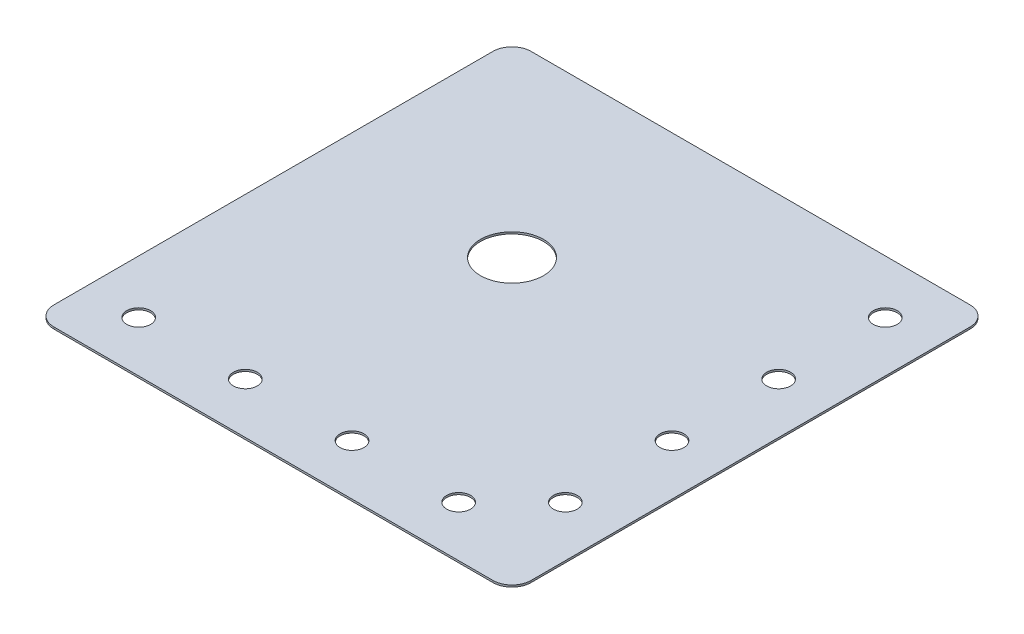
ISO-10303-21;
HEADER;
FILE_DESCRIPTION(('STEP AP214'),'2;1');
FILE_NAME('part.step','',(''),(''),'','','');
FILE_SCHEMA(('AUTOMOTIVE_DESIGN { 1 0 10303 214 1 1 1 1 }'));
ENDSEC;
DATA;
#1=APPLICATION_CONTEXT('core data for automotive mechanical design processes');
#2=APPLICATION_PROTOCOL_DEFINITION('international standard','automotive_design',2000,#1);
#3=PRODUCT_CONTEXT('',#1,'mechanical');
#4=PRODUCT('Part','Part','',(#3));
#5=PRODUCT_RELATED_PRODUCT_CATEGORY('part','',(#4));
#6=PRODUCT_DEFINITION_FORMATION('','',#4);
#7=PRODUCT_DEFINITION_CONTEXT('part definition',#1,'design');
#8=PRODUCT_DEFINITION('design','',#6,#7);
#9=PRODUCT_DEFINITION_SHAPE('','',#8);
#10=(LENGTH_UNIT() NAMED_UNIT(*) SI_UNIT(.MILLI.,.METRE.));
#11=(NAMED_UNIT(*) PLANE_ANGLE_UNIT() SI_UNIT($,.RADIAN.));
#12=(NAMED_UNIT(*) SI_UNIT($,.STERADIAN.) SOLID_ANGLE_UNIT());
#13=UNCERTAINTY_MEASURE_WITH_UNIT(LENGTH_MEASURE(1.E-05),#10,'distance_accuracy_value','');
#14=(GEOMETRIC_REPRESENTATION_CONTEXT(3) GLOBAL_UNCERTAINTY_ASSIGNED_CONTEXT((#13)) GLOBAL_UNIT_ASSIGNED_CONTEXT((#10,
#11,#12)) REPRESENTATION_CONTEXT('',''));
#15=CARTESIAN_POINT('',(0.,0.,0.));
#16=DIRECTION('',(0.,0.,1.));
#17=DIRECTION('',(1.,0.,0.));
#18=AXIS2_PLACEMENT_3D('',#15,#16,#17);
#19=CARTESIAN_POINT('',(-35.3672430253527,0.2,-42.9250026519572));
#20=DIRECTION('',(0.,1.,0.));
#21=DIRECTION('',(0.,0.,1.));
#22=AXIS2_PLACEMENT_3D('',#19,#20,#21);
#23=PLANE('',#22);
#24=CARTESIAN_POINT('',(-20.6047430253527,0.2,-0.225002651957146));
#25=DIRECTION('',(0.,1.,0.));
#26=DIRECTION('',(0.,0.,1.));
#27=AXIS2_PLACEMENT_3D('',#24,#25,#26);
#28=CIRCLE('',#27,1.25);
#29=CARTESIAN_POINT('',(-20.6047430253527,0.2,1.02499734804285));
#30=VERTEX_POINT('',#29);
#31=EDGE_CURVE('E224',#30,#30,#28,.T.);
#32=ORIENTED_EDGE('',*,*,#31,.F.);
#33=EDGE_LOOP('',(#32));
#34=FACE_BOUND('',#33,.T.);
#35=CARTESIAN_POINT('',(1.74525697464729,0.2,-0.225002651957146));
#36=DIRECTION('',(0.,1.,0.));
#37=DIRECTION('',(0.,0.,1.));
#38=AXIS2_PLACEMENT_3D('',#35,#36,#37);
#39=CIRCLE('',#38,1.25);
#40=CARTESIAN_POINT('',(1.74525697464729,0.2,1.02499734804285));
#41=VERTEX_POINT('',#40);
#42=EDGE_CURVE('E212',#41,#41,#39,.T.);
#43=ORIENTED_EDGE('',*,*,#42,.F.);
#44=EDGE_LOOP('',(#43));
#45=FACE_BOUND('',#44,.T.);
#46=CARTESIAN_POINT('',(7.3327569746473,0.2,-39.3375026519572));
#47=DIRECTION('',(0.,1.,0.));
#48=DIRECTION('',(0.,0.,1.));
#49=AXIS2_PLACEMENT_3D('',#46,#47,#48);
#50=CIRCLE('',#49,1.25);
#51=CARTESIAN_POINT('',(7.3327569746473,0.2,-38.0875026519572));
#52=VERTEX_POINT('',#51);
#53=EDGE_CURVE('E200',#52,#52,#50,.T.);
#54=ORIENTED_EDGE('',*,*,#53,.F.);
#55=EDGE_LOOP('',(#54));
#56=FACE_BOUND('',#55,.T.);
#57=CARTESIAN_POINT('',(7.3327569746473,0.2,-16.9875026519572));
#58=DIRECTION('',(0.,1.,0.));
#59=DIRECTION('',(0.,0.,1.));
#60=AXIS2_PLACEMENT_3D('',#57,#58,#59);
#61=CIRCLE('',#60,1.25);
#62=CARTESIAN_POINT('',(7.3327569746473,0.2,-15.7375026519572));
#63=VERTEX_POINT('',#62);
#64=EDGE_CURVE('E188',#63,#63,#61,.T.);
#65=ORIENTED_EDGE('',*,*,#64,.F.);
#66=EDGE_LOOP('',(#65));
#67=FACE_BOUND('',#66,.T.);
#68=CARTESIAN_POINT('',(-35.3672430253527,0.2,-42.9250026519572));
#69=DIRECTION('',(0.,1.,0.));
#70=DIRECTION('',(0.,0.,1.));
#71=AXIS2_PLACEMENT_3D('',#68,#69,#70);
#72=CIRCLE('',#71,2.);
#73=CARTESIAN_POINT('',(-35.3672430253527,0.2,-44.9250026519572));
#74=VERTEX_POINT('',#73);
#75=CARTESIAN_POINT('',(-37.3672430253527,0.2,-42.9250026519572));
#76=VERTEX_POINT('',#75);
#77=EDGE_CURVE('E151',#74,#76,#72,.T.);
#78=ORIENTED_EDGE('',*,*,#77,.T.);
#79=DIRECTION('',(0.,0.,1.));
#80=VECTOR('',#79,1.);
#81=CARTESIAN_POINT('',(-37.3672430253527,0.2,-42.9250026519572));
#82=LINE('',#81,#80);
#83=CARTESIAN_POINT('',(-37.3672430253527,0.2,3.07499734804285));
#84=VERTEX_POINT('',#83);
#85=EDGE_CURVE('E99',#76,#84,#82,.T.);
#86=ORIENTED_EDGE('',*,*,#85,.T.);
#87=CARTESIAN_POINT('',(-35.3672430253527,0.2,3.07499734804285));
#88=DIRECTION('',(0.,1.,0.));
#89=DIRECTION('',(0.,0.,1.));
#90=AXIS2_PLACEMENT_3D('',#87,#88,#89);
#91=CIRCLE('',#90,2.);
#92=CARTESIAN_POINT('',(-35.3672430253527,0.2,5.07499734804285));
#93=VERTEX_POINT('',#92);
#94=EDGE_CURVE('E166',#84,#93,#91,.T.);
#95=ORIENTED_EDGE('',*,*,#94,.T.);
#96=DIRECTION('',(1.,0.,0.));
#97=VECTOR('',#96,1.);
#98=CARTESIAN_POINT('',(-35.3672430253527,0.2,5.07499734804285));
#99=LINE('',#98,#97);
#100=CARTESIAN_POINT('',(10.6327569746473,0.2,5.07499734804285));
#101=VERTEX_POINT('',#100);
#102=EDGE_CURVE('E179',#93,#101,#99,.T.);
#103=ORIENTED_EDGE('',*,*,#102,.T.);
#104=CARTESIAN_POINT('',(10.6327569746473,0.2,3.07499734804285));
#105=DIRECTION('',(0.,1.,0.));
#106=DIRECTION('',(0.,0.,1.));
#107=AXIS2_PLACEMENT_3D('',#104,#105,#106);
#108=CIRCLE('',#107,2.);
#109=CARTESIAN_POINT('',(12.6327569746473,0.2,3.07499734804285));
#110=VERTEX_POINT('',#109);
#111=EDGE_CURVE('E118',#101,#110,#108,.T.);
#112=ORIENTED_EDGE('',*,*,#111,.T.);
#113=DIRECTION('',(0.,0.,-1.));
#114=VECTOR('',#113,1.);
#115=CARTESIAN_POINT('',(12.6327569746473,0.2,3.07499734804285));
#116=LINE('',#115,#114);
#117=CARTESIAN_POINT('',(12.6327569746473,0.2,-42.9250026519572));
#118=VERTEX_POINT('',#117);
#119=EDGE_CURVE('E112',#110,#118,#116,.T.);
#120=ORIENTED_EDGE('',*,*,#119,.T.);
#121=CARTESIAN_POINT('',(10.6327569746473,0.2,-42.9250026519572));
#122=DIRECTION('',(0.,1.,0.));
#123=DIRECTION('',(0.,0.,1.));
#124=AXIS2_PLACEMENT_3D('',#121,#122,#123);
#125=CIRCLE('',#124,2.);
#126=CARTESIAN_POINT('',(10.6327569746473,0.2,-44.9250026519572));
#127=VERTEX_POINT('',#126);
#128=EDGE_CURVE('E116',#118,#127,#125,.T.);
#129=ORIENTED_EDGE('',*,*,#128,.T.);
#130=DIRECTION('',(-1.,0.,0.));
#131=VECTOR('',#130,1.);
#132=CARTESIAN_POINT('',(10.6327569746473,0.2,-44.9250026519572));
#133=LINE('',#132,#131);
#134=EDGE_CURVE('E56',#127,#74,#133,.T.);
#135=ORIENTED_EDGE('',*,*,#134,.T.);
#136=EDGE_LOOP('',(#78,#86,#95,#103,#112,#120,#129,#135));
#137=FACE_BOUND('',#136,.T.);
#138=CARTESIAN_POINT('',(-17.6672430253527,0.2,-25.2250026519572));
#139=DIRECTION('',(0.,1.,0.));
#140=DIRECTION('',(0.,0.,1.));
#141=AXIS2_PLACEMENT_3D('',#138,#139,#140);
#142=CIRCLE('',#141,3.3);
#143=CARTESIAN_POINT('',(-17.6672430253527,0.2,-21.9250026519572));
#144=VERTEX_POINT('',#143);
#145=EDGE_CURVE('E140',#144,#144,#142,.T.);
#146=ORIENTED_EDGE('',*,*,#145,.F.);
#147=EDGE_LOOP('',(#146));
#148=FACE_BOUND('',#147,.T.);
#149=CARTESIAN_POINT('',(7.3327569746473,0.2,-28.1625026519572));
#150=DIRECTION('',(0.,1.,0.));
#151=DIRECTION('',(0.,0.,1.));
#152=AXIS2_PLACEMENT_3D('',#149,#150,#151);
#153=CIRCLE('',#152,1.25);
#154=CARTESIAN_POINT('',(7.3327569746473,0.2,-26.9125026519572));
#155=VERTEX_POINT('',#154);
#156=EDGE_CURVE('E194',#155,#155,#153,.T.);
#157=ORIENTED_EDGE('',*,*,#156,.F.);
#158=EDGE_LOOP('',(#157));
#159=FACE_BOUND('',#158,.T.);
#160=CARTESIAN_POINT('',(7.33275697464729,0.2,-5.81250265195715));
#161=DIRECTION('',(0.,1.,0.));
#162=DIRECTION('',(0.,0.,1.));
#163=AXIS2_PLACEMENT_3D('',#160,#161,#162);
#164=CIRCLE('',#163,1.25);
#165=CARTESIAN_POINT('',(7.33275697464729,0.2,-4.56250265195715));
#166=VERTEX_POINT('',#165);
#167=EDGE_CURVE('E206',#166,#166,#164,.T.);
#168=ORIENTED_EDGE('',*,*,#167,.F.);
#169=EDGE_LOOP('',(#168));
#170=FACE_BOUND('',#169,.T.);
#171=CARTESIAN_POINT('',(-9.42974302535271,0.2,-0.225002651957146));
#172=DIRECTION('',(0.,1.,0.));
#173=DIRECTION('',(0.,0.,1.));
#174=AXIS2_PLACEMENT_3D('',#171,#172,#173);
#175=CIRCLE('',#174,1.25);
#176=CARTESIAN_POINT('',(-9.42974302535271,0.2,1.02499734804285));
#177=VERTEX_POINT('',#176);
#178=EDGE_CURVE('E218',#177,#177,#175,.T.);
#179=ORIENTED_EDGE('',*,*,#178,.F.);
#180=EDGE_LOOP('',(#179));
#181=FACE_BOUND('',#180,.T.);
#182=CARTESIAN_POINT('',(-31.7797430253527,0.2,-0.225002651957146));
#183=DIRECTION('',(0.,1.,0.));
#184=DIRECTION('',(0.,0.,1.));
#185=AXIS2_PLACEMENT_3D('',#182,#183,#184);
#186=CIRCLE('',#185,1.24999999999999);
#187=CARTESIAN_POINT('',(-31.7797430253527,0.2,1.02499734804285));
#188=VERTEX_POINT('',#187);
#189=EDGE_CURVE('E230',#188,#188,#186,.T.);
#190=ORIENTED_EDGE('',*,*,#189,.F.);
#191=EDGE_LOOP('',(#190));
#192=FACE_BOUND('',#191,.T.);
#193=ADVANCED_FACE('F39',(#34,#45,#56,#67,#137,#148,#159,#170,#181,#192),#23,.T.);
#194=CARTESIAN_POINT('',(-35.3672430253527,0.,-42.9250026519572));
#195=DIRECTION('',(0.,1.,0.));
#196=DIRECTION('',(0.,0.,1.));
#197=AXIS2_PLACEMENT_3D('',#194,#195,#196);
#198=PLANE('',#197);
#199=CARTESIAN_POINT('',(-35.3672430253527,0.,-42.9250026519572));
#200=DIRECTION('',(0.,1.,0.));
#201=DIRECTION('',(0.,0.,1.));
#202=AXIS2_PLACEMENT_3D('',#199,#200,#201);
#203=CIRCLE('',#202,2.);
#204=CARTESIAN_POINT('',(-35.3672430253527,0.,-44.9250026519572));
#205=VERTEX_POINT('',#204);
#206=CARTESIAN_POINT('',(-37.3672430253527,0.,-42.9250026519572));
#207=VERTEX_POINT('',#206);
#208=EDGE_CURVE('E136',#205,#207,#203,.T.);
#209=ORIENTED_EDGE('',*,*,#208,.F.);
#210=DIRECTION('',(-1.,0.,0.));
#211=VECTOR('',#210,1.);
#212=CARTESIAN_POINT('',(10.6327569746473,0.,-44.9250026519572));
#213=LINE('',#212,#211);
#214=CARTESIAN_POINT('',(10.6327569746473,0.,-44.9250026519572));
#215=VERTEX_POINT('',#214);
#216=EDGE_CURVE('E91',#215,#205,#213,.T.);
#217=ORIENTED_EDGE('',*,*,#216,.F.);
#218=CARTESIAN_POINT('',(10.6327569746473,0.,-42.9250026519572));
#219=DIRECTION('',(0.,1.,0.));
#220=DIRECTION('',(0.,0.,1.));
#221=AXIS2_PLACEMENT_3D('',#218,#219,#220);
#222=CIRCLE('',#221,2.);
#223=CARTESIAN_POINT('',(12.6327569746473,0.,-42.9250026519572));
#224=VERTEX_POINT('',#223);
#225=EDGE_CURVE('E85',#224,#215,#222,.T.);
#226=ORIENTED_EDGE('',*,*,#225,.F.);
#227=DIRECTION('',(0.,0.,-1.));
#228=VECTOR('',#227,1.);
#229=CARTESIAN_POINT('',(12.6327569746473,0.,3.07499734804285));
#230=LINE('',#229,#228);
#231=CARTESIAN_POINT('',(12.6327569746473,0.,3.07499734804285));
#232=VERTEX_POINT('',#231);
#233=EDGE_CURVE('E126',#232,#224,#230,.T.);
#234=ORIENTED_EDGE('',*,*,#233,.F.);
#235=CARTESIAN_POINT('',(10.6327569746473,0.,3.07499734804285));
#236=DIRECTION('',(0.,1.,0.));
#237=DIRECTION('',(0.,0.,1.));
#238=AXIS2_PLACEMENT_3D('',#235,#236,#237);
#239=CIRCLE('',#238,2.);
#240=CARTESIAN_POINT('',(10.6327569746473,0.,5.07499734804285));
#241=VERTEX_POINT('',#240);
#242=EDGE_CURVE('E146',#241,#232,#239,.T.);
#243=ORIENTED_EDGE('',*,*,#242,.F.);
#244=DIRECTION('',(1.,0.,0.));
#245=VECTOR('',#244,1.);
#246=CARTESIAN_POINT('',(-35.3672430253527,0.,5.07499734804285));
#247=LINE('',#246,#245);
#248=CARTESIAN_POINT('',(-35.3672430253527,0.,5.07499734804285));
#249=VERTEX_POINT('',#248);
#250=EDGE_CURVE('E144',#249,#241,#247,.T.);
#251=ORIENTED_EDGE('',*,*,#250,.F.);
#252=CARTESIAN_POINT('',(-35.3672430253527,0.,3.07499734804285));
#253=DIRECTION('',(0.,1.,0.));
#254=DIRECTION('',(0.,0.,1.));
#255=AXIS2_PLACEMENT_3D('',#252,#253,#254);
#256=CIRCLE('',#255,2.);
#257=CARTESIAN_POINT('',(-37.3672430253527,0.,3.07499734804285));
#258=VERTEX_POINT('',#257);
#259=EDGE_CURVE('E142',#258,#249,#256,.T.);
#260=ORIENTED_EDGE('',*,*,#259,.F.);
#261=DIRECTION('',(0.,0.,1.));
#262=VECTOR('',#261,1.);
#263=CARTESIAN_POINT('',(-37.3672430253527,0.,-42.9250026519572));
#264=LINE('',#263,#262);
#265=EDGE_CURVE('E139',#207,#258,#264,.T.);
#266=ORIENTED_EDGE('',*,*,#265,.F.);
#267=EDGE_LOOP('',(#209,#217,#226,#234,#243,#251,#260,#266));
#268=FACE_BOUND('',#267,.T.);
#269=CARTESIAN_POINT('',(-17.6672430253527,0.,-25.2250026519572));
#270=DIRECTION('',(0.,1.,0.));
#271=DIRECTION('',(0.,0.,1.));
#272=AXIS2_PLACEMENT_3D('',#269,#270,#271);
#273=CIRCLE('',#272,3.3);
#274=CARTESIAN_POINT('',(-17.6672430253527,0.,-21.9250026519572));
#275=VERTEX_POINT('',#274);
#276=EDGE_CURVE('E185',#275,#275,#273,.T.);
#277=ORIENTED_EDGE('',*,*,#276,.T.);
#278=EDGE_LOOP('',(#277));
#279=FACE_BOUND('',#278,.T.);
#280=CARTESIAN_POINT('',(7.3327569746473,0.,-16.9875026519572));
#281=DIRECTION('',(0.,1.,0.));
#282=DIRECTION('',(0.,0.,1.));
#283=AXIS2_PLACEMENT_3D('',#280,#281,#282);
#284=CIRCLE('',#283,1.25);
#285=CARTESIAN_POINT('',(7.3327569746473,0.,-15.7375026519572));
#286=VERTEX_POINT('',#285);
#287=EDGE_CURVE('E191',#286,#286,#284,.T.);
#288=ORIENTED_EDGE('',*,*,#287,.T.);
#289=EDGE_LOOP('',(#288));
#290=FACE_BOUND('',#289,.T.);
#291=CARTESIAN_POINT('',(7.3327569746473,0.,-28.1625026519572));
#292=DIRECTION('',(0.,1.,0.));
#293=DIRECTION('',(0.,0.,1.));
#294=AXIS2_PLACEMENT_3D('',#291,#292,#293);
#295=CIRCLE('',#294,1.25);
#296=CARTESIAN_POINT('',(7.3327569746473,0.,-26.9125026519572));
#297=VERTEX_POINT('',#296);
#298=EDGE_CURVE('E197',#297,#297,#295,.T.);
#299=ORIENTED_EDGE('',*,*,#298,.T.);
#300=EDGE_LOOP('',(#299));
#301=FACE_BOUND('',#300,.T.);
#302=CARTESIAN_POINT('',(7.3327569746473,0.,-39.3375026519572));
#303=DIRECTION('',(0.,1.,0.));
#304=DIRECTION('',(0.,0.,1.));
#305=AXIS2_PLACEMENT_3D('',#302,#303,#304);
#306=CIRCLE('',#305,1.25);
#307=CARTESIAN_POINT('',(7.3327569746473,0.,-38.0875026519572));
#308=VERTEX_POINT('',#307);
#309=EDGE_CURVE('E203',#308,#308,#306,.T.);
#310=ORIENTED_EDGE('',*,*,#309,.T.);
#311=EDGE_LOOP('',(#310));
#312=FACE_BOUND('',#311,.T.);
#313=CARTESIAN_POINT('',(7.33275697464729,0.,-5.81250265195715));
#314=DIRECTION('',(0.,1.,0.));
#315=DIRECTION('',(0.,0.,1.));
#316=AXIS2_PLACEMENT_3D('',#313,#314,#315);
#317=CIRCLE('',#316,1.25);
#318=CARTESIAN_POINT('',(7.33275697464729,0.,-4.56250265195715));
#319=VERTEX_POINT('',#318);
#320=EDGE_CURVE('E209',#319,#319,#317,.T.);
#321=ORIENTED_EDGE('',*,*,#320,.T.);
#322=EDGE_LOOP('',(#321));
#323=FACE_BOUND('',#322,.T.);
#324=CARTESIAN_POINT('',(1.74525697464729,0.,-0.225002651957146));
#325=DIRECTION('',(0.,1.,0.));
#326=DIRECTION('',(0.,0.,1.));
#327=AXIS2_PLACEMENT_3D('',#324,#325,#326);
#328=CIRCLE('',#327,1.25);
#329=CARTESIAN_POINT('',(1.74525697464729,0.,1.02499734804285));
#330=VERTEX_POINT('',#329);
#331=EDGE_CURVE('E215',#330,#330,#328,.T.);
#332=ORIENTED_EDGE('',*,*,#331,.T.);
#333=EDGE_LOOP('',(#332));
#334=FACE_BOUND('',#333,.T.);
#335=CARTESIAN_POINT('',(-9.42974302535271,0.,-0.225002651957146));
#336=DIRECTION('',(0.,1.,0.));
#337=DIRECTION('',(0.,0.,1.));
#338=AXIS2_PLACEMENT_3D('',#335,#336,#337);
#339=CIRCLE('',#338,1.25);
#340=CARTESIAN_POINT('',(-9.42974302535271,0.,1.02499734804285));
#341=VERTEX_POINT('',#340);
#342=EDGE_CURVE('E221',#341,#341,#339,.T.);
#343=ORIENTED_EDGE('',*,*,#342,.T.);
#344=EDGE_LOOP('',(#343));
#345=FACE_BOUND('',#344,.T.);
#346=CARTESIAN_POINT('',(-20.6047430253527,0.,-0.225002651957146));
#347=DIRECTION('',(0.,1.,0.));
#348=DIRECTION('',(0.,0.,1.));
#349=AXIS2_PLACEMENT_3D('',#346,#347,#348);
#350=CIRCLE('',#349,1.25);
#351=CARTESIAN_POINT('',(-20.6047430253527,0.,1.02499734804285));
#352=VERTEX_POINT('',#351);
#353=EDGE_CURVE('E227',#352,#352,#350,.T.);
#354=ORIENTED_EDGE('',*,*,#353,.T.);
#355=EDGE_LOOP('',(#354));
#356=FACE_BOUND('',#355,.T.);
#357=CARTESIAN_POINT('',(-31.7797430253527,0.,-0.225002651957146));
#358=DIRECTION('',(0.,1.,0.));
#359=DIRECTION('',(0.,0.,1.));
#360=AXIS2_PLACEMENT_3D('',#357,#358,#359);
#361=CIRCLE('',#360,1.24999999999999);
#362=CARTESIAN_POINT('',(-31.7797430253527,0.,1.02499734804285));
#363=VERTEX_POINT('',#362);
#364=EDGE_CURVE('E233',#363,#363,#361,.T.);
#365=ORIENTED_EDGE('',*,*,#364,.T.);
#366=EDGE_LOOP('',(#365));
#367=FACE_BOUND('',#366,.T.);
#368=ADVANCED_FACE('F170',(#268,#279,#290,#301,#312,#323,#334,#345,#356,#367),#198,.F.);
#369=CARTESIAN_POINT('',(-35.3672430253527,0.2,-42.9250026519572));
#370=DIRECTION('',(0.,-1.,0.));
#371=DIRECTION('',(0.,0.,-1.));
#372=AXIS2_PLACEMENT_3D('',#369,#370,#371);
#373=CYLINDRICAL_SURFACE('',#372,2.);
#374=ORIENTED_EDGE('',*,*,#208,.T.);
#375=DIRECTION('',(0.,-1.,0.));
#376=VECTOR('',#375,1.);
#377=CARTESIAN_POINT('',(-37.3672430253527,0.2,-42.9250026519572));
#378=LINE('',#377,#376);
#379=EDGE_CURVE('E11',#76,#207,#378,.T.);
#380=ORIENTED_EDGE('',*,*,#379,.F.);
#381=ORIENTED_EDGE('',*,*,#77,.F.);
#382=DIRECTION('',(0.,-1.,0.));
#383=VECTOR('',#382,1.);
#384=CARTESIAN_POINT('',(-35.3672430253527,0.2,-44.9250026519572));
#385=LINE('',#384,#383);
#386=EDGE_CURVE('E132',#74,#205,#385,.T.);
#387=ORIENTED_EDGE('',*,*,#386,.T.);
#388=EDGE_LOOP('',(#374,#380,#381,#387));
#389=FACE_BOUND('',#388,.T.);
#390=ADVANCED_FACE('F41',(#389),#373,.T.);
#391=CARTESIAN_POINT('',(-37.3672430253527,0.2,-42.9250026519572));
#392=DIRECTION('',(1.,0.,0.));
#393=DIRECTION('',(0.,0.,-1.));
#394=AXIS2_PLACEMENT_3D('',#391,#392,#393);
#395=PLANE('',#394);
#396=ORIENTED_EDGE('',*,*,#265,.T.);
#397=DIRECTION('',(0.,-1.,0.));
#398=VECTOR('',#397,1.);
#399=CARTESIAN_POINT('',(-37.3672430253527,0.2,3.07499734804285));
#400=LINE('',#399,#398);
#401=EDGE_CURVE('E48',#84,#258,#400,.T.);
#402=ORIENTED_EDGE('',*,*,#401,.F.);
#403=ORIENTED_EDGE('',*,*,#85,.F.);
#404=ORIENTED_EDGE('',*,*,#379,.T.);
#405=EDGE_LOOP('',(#396,#402,#403,#404));
#406=FACE_BOUND('',#405,.T.);
#407=ADVANCED_FACE('F267',(#406),#395,.F.);
#408=CARTESIAN_POINT('',(-35.3672430253527,0.2,3.07499734804285));
#409=DIRECTION('',(0.,-1.,0.));
#410=DIRECTION('',(0.,0.,-1.));
#411=AXIS2_PLACEMENT_3D('',#408,#409,#410);
#412=CYLINDRICAL_SURFACE('',#411,2.);
#413=ORIENTED_EDGE('',*,*,#259,.T.);
#414=DIRECTION('',(0.,-1.,0.));
#415=VECTOR('',#414,1.);
#416=CARTESIAN_POINT('',(-35.3672430253527,0.2,5.07499734804285));
#417=LINE('',#416,#415);
#418=EDGE_CURVE('E158',#93,#249,#417,.T.);
#419=ORIENTED_EDGE('',*,*,#418,.F.);
#420=ORIENTED_EDGE('',*,*,#94,.F.);
#421=ORIENTED_EDGE('',*,*,#401,.T.);
#422=EDGE_LOOP('',(#413,#419,#420,#421));
#423=FACE_BOUND('',#422,.T.);
#424=ADVANCED_FACE('F164',(#423),#412,.T.);
#425=CARTESIAN_POINT('',(-35.3672430253527,0.2,5.07499734804285));
#426=DIRECTION('',(0.,0.,-1.));
#427=DIRECTION('',(-1.,0.,0.));
#428=AXIS2_PLACEMENT_3D('',#425,#426,#427);
#429=PLANE('',#428);
#430=ORIENTED_EDGE('',*,*,#250,.T.);
#431=DIRECTION('',(0.,-1.,0.));
#432=VECTOR('',#431,1.);
#433=CARTESIAN_POINT('',(10.6327569746473,0.2,5.07499734804285));
#434=LINE('',#433,#432);
#435=EDGE_CURVE('E155',#101,#241,#434,.T.);
#436=ORIENTED_EDGE('',*,*,#435,.F.);
#437=ORIENTED_EDGE('',*,*,#102,.F.);
#438=ORIENTED_EDGE('',*,*,#418,.T.);
#439=EDGE_LOOP('',(#430,#436,#437,#438));
#440=FACE_BOUND('',#439,.T.);
#441=ADVANCED_FACE('F175',(#440),#429,.F.);
#442=CARTESIAN_POINT('',(10.6327569746473,0.2,3.07499734804285));
#443=DIRECTION('',(0.,-1.,0.));
#444=DIRECTION('',(0.,0.,-1.));
#445=AXIS2_PLACEMENT_3D('',#442,#443,#444);
#446=CYLINDRICAL_SURFACE('',#445,2.);
#447=ORIENTED_EDGE('',*,*,#242,.T.);
#448=DIRECTION('',(0.,-1.,0.));
#449=VECTOR('',#448,1.);
#450=CARTESIAN_POINT('',(12.6327569746473,0.2,3.07499734804285));
#451=LINE('',#450,#449);
#452=EDGE_CURVE('E127',#110,#232,#451,.T.);
#453=ORIENTED_EDGE('',*,*,#452,.F.);
#454=ORIENTED_EDGE('',*,*,#111,.F.);
#455=ORIENTED_EDGE('',*,*,#435,.T.);
#456=EDGE_LOOP('',(#447,#453,#454,#455));
#457=FACE_BOUND('',#456,.T.);
#458=ADVANCED_FACE('F178',(#457),#446,.T.);
#459=CARTESIAN_POINT('',(12.6327569746473,0.2,3.07499734804285));
#460=DIRECTION('',(-1.,0.,0.));
#461=DIRECTION('',(0.,0.,1.));
#462=AXIS2_PLACEMENT_3D('',#459,#460,#461);
#463=PLANE('',#462);
#464=ORIENTED_EDGE('',*,*,#233,.T.);
#465=DIRECTION('',(0.,-1.,0.));
#466=VECTOR('',#465,1.);
#467=CARTESIAN_POINT('',(12.6327569746473,0.2,-42.9250026519572));
#468=LINE('',#467,#466);
#469=EDGE_CURVE('E123',#118,#224,#468,.T.);
#470=ORIENTED_EDGE('',*,*,#469,.F.);
#471=ORIENTED_EDGE('',*,*,#119,.F.);
#472=ORIENTED_EDGE('',*,*,#452,.T.);
#473=EDGE_LOOP('',(#464,#470,#471,#472));
#474=FACE_BOUND('',#473,.T.);
#475=ADVANCED_FACE('F124',(#474),#463,.F.);
#476=CARTESIAN_POINT('',(10.6327569746473,0.2,-42.9250026519572));
#477=DIRECTION('',(0.,-1.,0.));
#478=DIRECTION('',(0.,0.,-1.));
#479=AXIS2_PLACEMENT_3D('',#476,#477,#478);
#480=CYLINDRICAL_SURFACE('',#479,2.);
#481=ORIENTED_EDGE('',*,*,#225,.T.);
#482=DIRECTION('',(0.,-1.,0.));
#483=VECTOR('',#482,1.);
#484=CARTESIAN_POINT('',(10.6327569746473,0.2,-44.9250026519572));
#485=LINE('',#484,#483);
#486=EDGE_CURVE('E128',#127,#215,#485,.T.);
#487=ORIENTED_EDGE('',*,*,#486,.F.);
#488=ORIENTED_EDGE('',*,*,#128,.F.);
#489=ORIENTED_EDGE('',*,*,#469,.T.);
#490=EDGE_LOOP('',(#481,#487,#488,#489));
#491=FACE_BOUND('',#490,.T.);
#492=ADVANCED_FACE('F130',(#491),#480,.T.);
#493=CARTESIAN_POINT('',(10.6327569746473,0.2,-44.9250026519572));
#494=DIRECTION('',(0.,0.,1.));
#495=DIRECTION('',(1.,0.,0.));
#496=AXIS2_PLACEMENT_3D('',#493,#494,#495);
#497=PLANE('',#496);
#498=ORIENTED_EDGE('',*,*,#216,.T.);
#499=ORIENTED_EDGE('',*,*,#386,.F.);
#500=ORIENTED_EDGE('',*,*,#134,.F.);
#501=ORIENTED_EDGE('',*,*,#486,.T.);
#502=EDGE_LOOP('',(#498,#499,#500,#501));
#503=FACE_BOUND('',#502,.T.);
#504=ADVANCED_FACE('F255',(#503),#497,.F.);
#505=CARTESIAN_POINT('',(-17.6672430253527,0.2,-25.2250026519572));
#506=DIRECTION('',(0.,-1.,0.));
#507=DIRECTION('',(0.,0.,-1.));
#508=AXIS2_PLACEMENT_3D('',#505,#506,#507);
#509=CYLINDRICAL_SURFACE('',#508,3.3);
#510=ORIENTED_EDGE('',*,*,#145,.T.);
#511=EDGE_LOOP('',(#510));
#512=FACE_BOUND('',#511,.T.);
#513=ORIENTED_EDGE('',*,*,#276,.F.);
#514=EDGE_LOOP('',(#513));
#515=FACE_BOUND('',#514,.T.);
#516=ADVANCED_FACE('F252',(#512,#515),#509,.F.);
#517=CARTESIAN_POINT('',(7.3327569746473,0.2,-16.9875026519572));
#518=DIRECTION('',(0.,-1.,0.));
#519=DIRECTION('',(0.,0.,-1.));
#520=AXIS2_PLACEMENT_3D('',#517,#518,#519);
#521=CYLINDRICAL_SURFACE('',#520,1.25);
#522=ORIENTED_EDGE('',*,*,#64,.T.);
#523=EDGE_LOOP('',(#522));
#524=FACE_BOUND('',#523,.T.);
#525=ORIENTED_EDGE('',*,*,#287,.F.);
#526=EDGE_LOOP('',(#525));
#527=FACE_BOUND('',#526,.T.);
#528=ADVANCED_FACE('F330',(#524,#527),#521,.F.);
#529=CARTESIAN_POINT('',(7.3327569746473,0.2,-28.1625026519572));
#530=DIRECTION('',(0.,-1.,0.));
#531=DIRECTION('',(0.,0.,-1.));
#532=AXIS2_PLACEMENT_3D('',#529,#530,#531);
#533=CYLINDRICAL_SURFACE('',#532,1.25);
#534=ORIENTED_EDGE('',*,*,#156,.T.);
#535=EDGE_LOOP('',(#534));
#536=FACE_BOUND('',#535,.T.);
#537=ORIENTED_EDGE('',*,*,#298,.F.);
#538=EDGE_LOOP('',(#537));
#539=FACE_BOUND('',#538,.T.);
#540=ADVANCED_FACE('F338',(#536,#539),#533,.F.);
#541=CARTESIAN_POINT('',(7.3327569746473,0.2,-39.3375026519572));
#542=DIRECTION('',(0.,-1.,0.));
#543=DIRECTION('',(0.,0.,-1.));
#544=AXIS2_PLACEMENT_3D('',#541,#542,#543);
#545=CYLINDRICAL_SURFACE('',#544,1.25);
#546=ORIENTED_EDGE('',*,*,#53,.T.);
#547=EDGE_LOOP('',(#546));
#548=FACE_BOUND('',#547,.T.);
#549=ORIENTED_EDGE('',*,*,#309,.F.);
#550=EDGE_LOOP('',(#549));
#551=FACE_BOUND('',#550,.T.);
#552=ADVANCED_FACE('F346',(#548,#551),#545,.F.);
#553=CARTESIAN_POINT('',(7.33275697464729,0.2,-5.81250265195715));
#554=DIRECTION('',(0.,-1.,0.));
#555=DIRECTION('',(0.,0.,-1.));
#556=AXIS2_PLACEMENT_3D('',#553,#554,#555);
#557=CYLINDRICAL_SURFACE('',#556,1.25);
#558=ORIENTED_EDGE('',*,*,#167,.T.);
#559=EDGE_LOOP('',(#558));
#560=FACE_BOUND('',#559,.T.);
#561=ORIENTED_EDGE('',*,*,#320,.F.);
#562=EDGE_LOOP('',(#561));
#563=FACE_BOUND('',#562,.T.);
#564=ADVANCED_FACE('F355',(#560,#563),#557,.F.);
#565=CARTESIAN_POINT('',(1.74525697464729,0.2,-0.225002651957146));
#566=DIRECTION('',(0.,-1.,0.));
#567=DIRECTION('',(0.,0.,-1.));
#568=AXIS2_PLACEMENT_3D('',#565,#566,#567);
#569=CYLINDRICAL_SURFACE('',#568,1.25);
#570=ORIENTED_EDGE('',*,*,#42,.T.);
#571=EDGE_LOOP('',(#570));
#572=FACE_BOUND('',#571,.T.);
#573=ORIENTED_EDGE('',*,*,#331,.F.);
#574=EDGE_LOOP('',(#573));
#575=FACE_BOUND('',#574,.T.);
#576=ADVANCED_FACE('F364',(#572,#575),#569,.F.);
#577=CARTESIAN_POINT('',(-9.42974302535271,0.2,-0.225002651957146));
#578=DIRECTION('',(0.,-1.,0.));
#579=DIRECTION('',(0.,0.,-1.));
#580=AXIS2_PLACEMENT_3D('',#577,#578,#579);
#581=CYLINDRICAL_SURFACE('',#580,1.25);
#582=ORIENTED_EDGE('',*,*,#178,.T.);
#583=EDGE_LOOP('',(#582));
#584=FACE_BOUND('',#583,.T.);
#585=ORIENTED_EDGE('',*,*,#342,.F.);
#586=EDGE_LOOP('',(#585));
#587=FACE_BOUND('',#586,.T.);
#588=ADVANCED_FACE('F373',(#584,#587),#581,.F.);
#589=CARTESIAN_POINT('',(-20.6047430253527,0.2,-0.225002651957146));
#590=DIRECTION('',(0.,-1.,0.));
#591=DIRECTION('',(0.,0.,-1.));
#592=AXIS2_PLACEMENT_3D('',#589,#590,#591);
#593=CYLINDRICAL_SURFACE('',#592,1.25);
#594=ORIENTED_EDGE('',*,*,#31,.T.);
#595=EDGE_LOOP('',(#594));
#596=FACE_BOUND('',#595,.T.);
#597=ORIENTED_EDGE('',*,*,#353,.F.);
#598=EDGE_LOOP('',(#597));
#599=FACE_BOUND('',#598,.T.);
#600=ADVANCED_FACE('F382',(#596,#599),#593,.F.);
#601=CARTESIAN_POINT('',(-31.7797430253527,0.2,-0.225002651957146));
#602=DIRECTION('',(0.,-1.,0.));
#603=DIRECTION('',(0.,0.,-1.));
#604=AXIS2_PLACEMENT_3D('',#601,#602,#603);
#605=CYLINDRICAL_SURFACE('',#604,1.24999999999999);
#606=ORIENTED_EDGE('',*,*,#189,.T.);
#607=EDGE_LOOP('',(#606));
#608=FACE_BOUND('',#607,.T.);
#609=ORIENTED_EDGE('',*,*,#364,.F.);
#610=EDGE_LOOP('',(#609));
#611=FACE_BOUND('',#610,.T.);
#612=ADVANCED_FACE('F239',(#608,#611),#605,.F.);
#613=CLOSED_SHELL('',(#193,#368,#390,#407,#424,#441,#458,#475,#492,#504,#516,#528,#540,#552,
#564,#576,#588,#600,#612));
#614=MANIFOLD_SOLID_BREP('B2',#613);
#615=ADVANCED_BREP_SHAPE_REPRESENTATION('',(#18,#614),#14);
#616=SHAPE_DEFINITION_REPRESENTATION(#9,#615);
ENDSEC;
END-ISO-10303-21;
